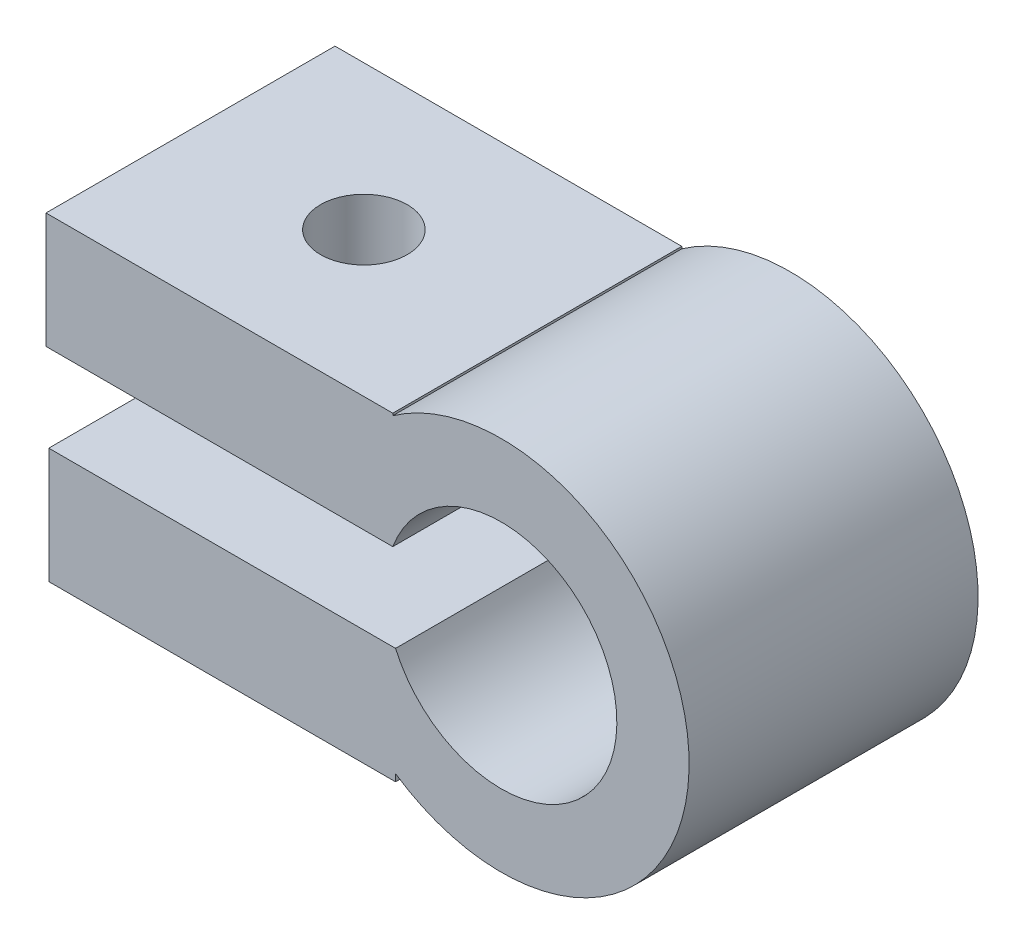
ISO-10303-21;
HEADER;
FILE_DESCRIPTION(('STEP AP214'),'2;1');
FILE_NAME('part.step','',(''),(''),'','','');
FILE_SCHEMA(('AUTOMOTIVE_DESIGN { 1 0 10303 214 1 1 1 1 }'));
ENDSEC;
DATA;
#1=APPLICATION_CONTEXT('core data for automotive mechanical design processes');
#2=APPLICATION_PROTOCOL_DEFINITION('international standard','automotive_design',2000,#1);
#3=PRODUCT_CONTEXT('',#1,'mechanical');
#4=PRODUCT('Part','Part','',(#3));
#5=PRODUCT_RELATED_PRODUCT_CATEGORY('part','',(#4));
#6=PRODUCT_DEFINITION_FORMATION('','',#4);
#7=PRODUCT_DEFINITION_CONTEXT('part definition',#1,'design');
#8=PRODUCT_DEFINITION('design','',#6,#7);
#9=PRODUCT_DEFINITION_SHAPE('','',#8);
#10=(LENGTH_UNIT() NAMED_UNIT(*) SI_UNIT(.MILLI.,.METRE.));
#11=(NAMED_UNIT(*) PLANE_ANGLE_UNIT() SI_UNIT($,.RADIAN.));
#12=(NAMED_UNIT(*) SI_UNIT($,.STERADIAN.) SOLID_ANGLE_UNIT());
#13=UNCERTAINTY_MEASURE_WITH_UNIT(LENGTH_MEASURE(1.E-05),#10,'distance_accuracy_value','');
#14=(GEOMETRIC_REPRESENTATION_CONTEXT(3) GLOBAL_UNCERTAINTY_ASSIGNED_CONTEXT((#13)) GLOBAL_UNIT_ASSIGNED_CONTEXT((#10,
#11,#12)) REPRESENTATION_CONTEXT('',''));
#15=CARTESIAN_POINT('',(0.,0.,0.));
#16=DIRECTION('',(0.,0.,1.));
#17=DIRECTION('',(1.,0.,0.));
#18=AXIS2_PLACEMENT_3D('',#15,#16,#17);
#19=CARTESIAN_POINT('',(-22.0691164066801,-32.0673494114416,5.));
#20=DIRECTION('',(0.,1.,0.));
#21=DIRECTION('',(-1.,0.,0.));
#22=AXIS2_PLACEMENT_3D('',#19,#20,#21);
#23=CYLINDRICAL_SURFACE('',#22,1.5);
#24=CARTESIAN_POINT('',(-22.0691164066801,0.932650588558397,5.));
#25=DIRECTION('',(0.,-1.,0.));
#26=DIRECTION('',(0.,0.,-1.));
#27=AXIS2_PLACEMENT_3D('',#24,#25,#26);
#28=CIRCLE('',#27,1.5);
#29=CARTESIAN_POINT('',(-22.0691164066801,0.932650588558397,3.5));
#30=VERTEX_POINT('',#29);
#31=EDGE_CURVE('E207',#30,#30,#28,.T.);
#32=ORIENTED_EDGE('',*,*,#31,.F.);
#33=EDGE_LOOP('',(#32));
#34=FACE_BOUND('',#33,.T.);
#35=CARTESIAN_POINT('',(-22.0691164066801,-0.0673494114416043,5.));
#36=DIRECTION('',(0.,-1.,0.));
#37=DIRECTION('',(1.,0.,0.));
#38=AXIS2_PLACEMENT_3D('',#35,#36,#37);
#39=CIRCLE('',#38,1.5);
#40=CARTESIAN_POINT('',(-20.5691164066801,-0.0673494114416041,5.));
#41=VERTEX_POINT('',#40);
#42=EDGE_CURVE('E37',#41,#41,#39,.F.);
#43=ORIENTED_EDGE('',*,*,#42,.F.);
#44=EDGE_LOOP('',(#43));
#45=FACE_BOUND('',#44,.T.);
#46=ADVANCED_FACE('F33',(#34,#45),#23,.F.);
#47=CARTESIAN_POINT('',(-12.3154220169601,2.55070325649938,10.));
#48=DIRECTION('',(0.,0.,-1.));
#49=DIRECTION('',(-1.,0.,0.));
#50=AXIS2_PLACEMENT_3D('',#47,#48,#49);
#51=CYLINDRICAL_SURFACE('',#50,6.5);
#52=DIRECTION('',(0.,0.,-1.));
#53=VECTOR('',#52,1.);
#54=CARTESIAN_POINT('',(-15.9735507139539,-2.82220046832493,10.));
#55=LINE('',#54,#53);
#56=CARTESIAN_POINT('',(-15.9735507139539,-2.82220046832493,0.));
#57=VERTEX_POINT('',#56);
#58=CARTESIAN_POINT('',(-15.9735507139539,-2.82220046832493,10.));
#59=VERTEX_POINT('',#58);
#60=EDGE_CURVE('E227',#57,#59,#55,.F.);
#61=ORIENTED_EDGE('',*,*,#60,.F.);
#62=CARTESIAN_POINT('',(-12.3154220169601,2.55070325649938,0.));
#63=DIRECTION('',(0.,0.,1.));
#64=DIRECTION('',(1.,0.,0.));
#65=AXIS2_PLACEMENT_3D('',#62,#63,#64);
#66=CIRCLE('',#65,6.5);
#67=CARTESIAN_POINT('',(-16.0691164066801,7.85728204405969,0.));
#68=VERTEX_POINT('',#67);
#69=EDGE_CURVE('E275',#57,#68,#66,.T.);
#70=ORIENTED_EDGE('',*,*,#69,.T.);
#71=DIRECTION('',(0.,0.,-1.));
#72=VECTOR('',#71,1.);
#73=CARTESIAN_POINT('',(-16.0691164066801,7.85728204405969,10.));
#74=LINE('',#73,#72);
#75=CARTESIAN_POINT('',(-16.0691164066801,7.85728204405969,10.));
#76=VERTEX_POINT('',#75);
#77=EDGE_CURVE('E259',#76,#68,#74,.T.);
#78=ORIENTED_EDGE('',*,*,#77,.F.);
#79=CARTESIAN_POINT('',(-12.3154220169601,2.55070325649938,10.));
#80=DIRECTION('',(0.,0.,1.));
#81=DIRECTION('',(1.,0.,0.));
#82=AXIS2_PLACEMENT_3D('',#79,#80,#81);
#83=CIRCLE('',#82,6.5);
#84=EDGE_CURVE('E278',#59,#76,#83,.T.);
#85=ORIENTED_EDGE('',*,*,#84,.F.);
#86=EDGE_LOOP('',(#61,#70,#78,#85));
#87=FACE_BOUND('',#86,.T.);
#88=ADVANCED_FACE('F35',(#87),#51,.T.);
#89=CARTESIAN_POINT('',(-12.3154220169601,2.55070325649938,10.));
#90=DIRECTION('',(0.,0.,1.));
#91=DIRECTION('',(1.,0.,0.));
#92=AXIS2_PLACEMENT_3D('',#89,#90,#91);
#93=PLANE('',#92);
#94=DIRECTION('',(1.,0.,0.));
#95=VECTOR('',#94,1.);
#96=CARTESIAN_POINT('',(-18.9664230387728,0.932650588558395,10.));
#97=LINE('',#96,#95);
#98=CARTESIAN_POINT('',(-27.9735507139539,0.932650588558394,10.));
#99=VERTEX_POINT('',#98);
#100=CARTESIAN_POINT('',(-15.9735507139539,0.932650588558395,10.));
#101=VERTEX_POINT('',#100);
#102=EDGE_CURVE('E262',#99,#101,#97,.T.);
#103=ORIENTED_EDGE('',*,*,#102,.F.);
#104=DIRECTION('',(0.,-1.,0.));
#105=VECTOR('',#104,1.);
#106=CARTESIAN_POINT('',(-27.9735507139539,0.932650588558394,10.));
#107=LINE('',#106,#105);
#108=CARTESIAN_POINT('',(-27.9735507139539,-3.06734941144161,10.));
#109=VERTEX_POINT('',#108);
#110=EDGE_CURVE('E219',#99,#109,#107,.T.);
#111=ORIENTED_EDGE('',*,*,#110,.T.);
#112=DIRECTION('',(-1.,0.,0.));
#113=VECTOR('',#112,1.);
#114=CARTESIAN_POINT('',(-15.9735507139539,-3.06734941144161,10.));
#115=LINE('',#114,#113);
#116=CARTESIAN_POINT('',(-15.9735507139539,-3.06734941144161,10.));
#117=VERTEX_POINT('',#116);
#118=EDGE_CURVE('E222',#117,#109,#115,.T.);
#119=ORIENTED_EDGE('',*,*,#118,.F.);
#120=DIRECTION('',(0.,-1.,0.));
#121=VECTOR('',#120,1.);
#122=CARTESIAN_POINT('',(-15.9735507139539,0.932650588558395,10.));
#123=LINE('',#122,#121);
#124=EDGE_CURVE('E57',#59,#117,#123,.T.);
#125=ORIENTED_EDGE('',*,*,#124,.F.);
#126=ORIENTED_EDGE('',*,*,#84,.T.);
#127=DIRECTION('',(0.,-1.,0.));
#128=VECTOR('',#127,1.);
#129=CARTESIAN_POINT('',(-16.0691164066801,7.9326505885584,10.));
#130=LINE('',#129,#128);
#131=CARTESIAN_POINT('',(-16.0691164066801,7.9326505885584,10.));
#132=VERTEX_POINT('',#131);
#133=EDGE_CURVE('E239',#132,#76,#130,.T.);
#134=ORIENTED_EDGE('',*,*,#133,.F.);
#135=DIRECTION('',(-1.,0.,0.));
#136=VECTOR('',#135,1.);
#137=CARTESIAN_POINT('',(-16.0691164066801,7.9326505885584,10.));
#138=LINE('',#137,#136);
#139=CARTESIAN_POINT('',(-28.0691164066801,7.93265058855839,10.));
#140=VERTEX_POINT('',#139);
#141=EDGE_CURVE('E248',#132,#140,#138,.T.);
#142=ORIENTED_EDGE('',*,*,#141,.T.);
#143=DIRECTION('',(0.,-1.,0.));
#144=VECTOR('',#143,1.);
#145=CARTESIAN_POINT('',(-28.0691164066801,7.93265058855839,10.));
#146=LINE('',#145,#144);
#147=CARTESIAN_POINT('',(-28.0691164066801,3.93265058855839,10.));
#148=VERTEX_POINT('',#147);
#149=EDGE_CURVE('E234',#140,#148,#146,.T.);
#150=ORIENTED_EDGE('',*,*,#149,.T.);
#151=DIRECTION('',(-1.,0.,0.));
#152=VECTOR('',#151,1.);
#153=CARTESIAN_POINT('',(-18.9664230387728,3.9326505885584,10.));
#154=LINE('',#153,#152);
#155=CARTESIAN_POINT('',(-16.0691164066801,3.9326505885584,10.));
#156=VERTEX_POINT('',#155);
#157=EDGE_CURVE('E264',#156,#148,#154,.T.);
#158=ORIENTED_EDGE('',*,*,#157,.F.);
#159=CARTESIAN_POINT('',(-12.3154220169601,2.55070325649938,10.));
#160=DIRECTION('',(0.,0.,1.));
#161=DIRECTION('',(1.,0.,0.));
#162=AXIS2_PLACEMENT_3D('',#159,#160,#161);
#163=CIRCLE('',#162,4.);
#164=EDGE_CURVE('E272',#101,#156,#163,.T.);
#165=ORIENTED_EDGE('',*,*,#164,.F.);
#166=EDGE_LOOP('',(#103,#111,#119,#125,#126,#134,#142,#150,#158,#165));
#167=FACE_BOUND('',#166,.T.);
#168=ADVANCED_FACE('F297',(#167),#93,.T.);
#169=CARTESIAN_POINT('',(-12.3154220169601,2.55070325649938,0.));
#170=DIRECTION('',(0.,0.,1.));
#171=DIRECTION('',(1.,0.,0.));
#172=AXIS2_PLACEMENT_3D('',#169,#170,#171);
#173=PLANE('',#172);
#174=DIRECTION('',(1.,0.,0.));
#175=VECTOR('',#174,1.);
#176=CARTESIAN_POINT('',(-12.3154220169601,0.932650588558395,0.));
#177=LINE('',#176,#175);
#178=CARTESIAN_POINT('',(-27.9735507139539,0.932650588558394,0.));
#179=VERTEX_POINT('',#178);
#180=CARTESIAN_POINT('',(-15.9735507139539,0.932650588558395,0.));
#181=VERTEX_POINT('',#180);
#182=EDGE_CURVE('E266',#179,#181,#177,.T.);
#183=ORIENTED_EDGE('',*,*,#182,.T.);
#184=CARTESIAN_POINT('',(-12.3154220169601,2.55070325649938,0.));
#185=DIRECTION('',(0.,0.,1.));
#186=DIRECTION('',(1.,0.,0.));
#187=AXIS2_PLACEMENT_3D('',#184,#185,#186);
#188=CIRCLE('',#187,4.);
#189=CARTESIAN_POINT('',(-16.0691164066801,3.9326505885584,0.));
#190=VERTEX_POINT('',#189);
#191=EDGE_CURVE('E271',#181,#190,#188,.T.);
#192=ORIENTED_EDGE('',*,*,#191,.T.);
#193=DIRECTION('',(-1.,0.,0.));
#194=VECTOR('',#193,1.);
#195=CARTESIAN_POINT('',(-12.3154220169601,3.9326505885584,0.));
#196=LINE('',#195,#194);
#197=CARTESIAN_POINT('',(-28.0691164066801,3.93265058855839,0.));
#198=VERTEX_POINT('',#197);
#199=EDGE_CURVE('E269',#190,#198,#196,.T.);
#200=ORIENTED_EDGE('',*,*,#199,.T.);
#201=DIRECTION('',(0.,-1.,0.));
#202=VECTOR('',#201,1.);
#203=CARTESIAN_POINT('',(-28.0691164066801,7.93265058855839,0.));
#204=LINE('',#203,#202);
#205=CARTESIAN_POINT('',(-28.0691164066801,7.93265058855839,0.));
#206=VERTEX_POINT('',#205);
#207=EDGE_CURVE('E235',#206,#198,#204,.T.);
#208=ORIENTED_EDGE('',*,*,#207,.F.);
#209=DIRECTION('',(-1.,0.,0.));
#210=VECTOR('',#209,1.);
#211=CARTESIAN_POINT('',(-16.0691164066801,7.9326505885584,0.));
#212=LINE('',#211,#210);
#213=CARTESIAN_POINT('',(-16.0691164066801,7.9326505885584,0.));
#214=VERTEX_POINT('',#213);
#215=EDGE_CURVE('E238',#214,#206,#212,.T.);
#216=ORIENTED_EDGE('',*,*,#215,.F.);
#217=DIRECTION('',(0.,-1.,0.));
#218=VECTOR('',#217,1.);
#219=CARTESIAN_POINT('',(-16.0691164066801,7.9326505885584,0.));
#220=LINE('',#219,#218);
#221=EDGE_CURVE('E242',#214,#68,#220,.T.);
#222=ORIENTED_EDGE('',*,*,#221,.T.);
#223=ORIENTED_EDGE('',*,*,#69,.F.);
#224=DIRECTION('',(0.,-1.,0.));
#225=VECTOR('',#224,1.);
#226=CARTESIAN_POINT('',(-15.9735507139539,0.932650588558395,0.));
#227=LINE('',#226,#225);
#228=CARTESIAN_POINT('',(-15.9735507139539,-3.06734941144161,0.));
#229=VERTEX_POINT('',#228);
#230=EDGE_CURVE('E223',#57,#229,#227,.T.);
#231=ORIENTED_EDGE('',*,*,#230,.T.);
#232=DIRECTION('',(-1.,0.,0.));
#233=VECTOR('',#232,1.);
#234=CARTESIAN_POINT('',(-15.9735507139539,-3.06734941144161,0.));
#235=LINE('',#234,#233);
#236=CARTESIAN_POINT('',(-27.9735507139539,-3.06734941144161,0.));
#237=VERTEX_POINT('',#236);
#238=EDGE_CURVE('E230',#229,#237,#235,.T.);
#239=ORIENTED_EDGE('',*,*,#238,.T.);
#240=DIRECTION('',(0.,-1.,0.));
#241=VECTOR('',#240,1.);
#242=CARTESIAN_POINT('',(-27.9735507139539,0.932650588558394,0.));
#243=LINE('',#242,#241);
#244=EDGE_CURVE('E218',#179,#237,#243,.T.);
#245=ORIENTED_EDGE('',*,*,#244,.F.);
#246=EDGE_LOOP('',(#183,#192,#200,#208,#216,#222,#223,#231,#239,#245));
#247=FACE_BOUND('',#246,.T.);
#248=ADVANCED_FACE('F290',(#247),#173,.F.);
#249=CARTESIAN_POINT('',(-12.3154220169601,2.55070325649938,10.));
#250=DIRECTION('',(0.,0.,-1.));
#251=DIRECTION('',(-1.,0.,0.));
#252=AXIS2_PLACEMENT_3D('',#249,#250,#251);
#253=CYLINDRICAL_SURFACE('',#252,4.);
#254=DIRECTION('',(0.,0.,-1.));
#255=VECTOR('',#254,1.);
#256=CARTESIAN_POINT('',(-16.0691164066801,3.9326505885584,10.));
#257=LINE('',#256,#255);
#258=EDGE_CURVE('E11',#190,#156,#257,.F.);
#259=ORIENTED_EDGE('',*,*,#258,.F.);
#260=ORIENTED_EDGE('',*,*,#191,.F.);
#261=DIRECTION('',(0.,0.,-1.));
#262=VECTOR('',#261,1.);
#263=CARTESIAN_POINT('',(-15.9735507139539,0.932650588558395,10.));
#264=LINE('',#263,#262);
#265=EDGE_CURVE('E42',#101,#181,#264,.T.);
#266=ORIENTED_EDGE('',*,*,#265,.F.);
#267=ORIENTED_EDGE('',*,*,#164,.T.);
#268=EDGE_LOOP('',(#259,#260,#266,#267));
#269=FACE_BOUND('',#268,.T.);
#270=ADVANCED_FACE('F292',(#269),#253,.F.);
#271=CARTESIAN_POINT('',(-18.9664230387728,0.932650588558395,-23.));
#272=DIRECTION('',(0.,-1.,0.));
#273=DIRECTION('',(0.,0.,-1.));
#274=AXIS2_PLACEMENT_3D('',#271,#272,#273);
#275=PLANE('',#274);
#276=ORIENTED_EDGE('',*,*,#31,.T.);
#277=EDGE_LOOP('',(#276));
#278=FACE_BOUND('',#277,.T.);
#279=ORIENTED_EDGE('',*,*,#102,.T.);
#280=ORIENTED_EDGE('',*,*,#265,.T.);
#281=ORIENTED_EDGE('',*,*,#182,.F.);
#282=DIRECTION('',(0.,0.,1.));
#283=VECTOR('',#282,1.);
#284=CARTESIAN_POINT('',(-27.9735507139539,0.932650588558394,0.));
#285=LINE('',#284,#283);
#286=EDGE_CURVE('E215',#179,#99,#285,.T.);
#287=ORIENTED_EDGE('',*,*,#286,.T.);
#288=EDGE_LOOP('',(#279,#280,#281,#287));
#289=FACE_BOUND('',#288,.T.);
#290=ADVANCED_FACE('F283',(#278,#289),#275,.F.);
#291=CARTESIAN_POINT('',(-18.9664230387728,3.9326505885584,-23.));
#292=DIRECTION('',(0.,1.,0.));
#293=DIRECTION('',(0.,0.,1.));
#294=AXIS2_PLACEMENT_3D('',#291,#292,#293);
#295=PLANE('',#294);
#296=CARTESIAN_POINT('',(-22.0691164066801,3.93265058855839,5.));
#297=DIRECTION('',(0.,1.,0.));
#298=DIRECTION('',(0.,0.,1.));
#299=AXIS2_PLACEMENT_3D('',#296,#297,#298);
#300=CIRCLE('',#299,1.5);
#301=CARTESIAN_POINT('',(-22.0691164066801,3.93265058855839,6.5));
#302=VERTEX_POINT('',#301);
#303=EDGE_CURVE('E204',#302,#302,#300,.T.);
#304=ORIENTED_EDGE('',*,*,#303,.T.);
#305=EDGE_LOOP('',(#304));
#306=FACE_BOUND('',#305,.T.);
#307=ORIENTED_EDGE('',*,*,#199,.F.);
#308=ORIENTED_EDGE('',*,*,#258,.T.);
#309=ORIENTED_EDGE('',*,*,#157,.T.);
#310=DIRECTION('',(0.,0.,1.));
#311=VECTOR('',#310,1.);
#312=CARTESIAN_POINT('',(-28.0691164066801,3.93265058855839,0.));
#313=LINE('',#312,#311);
#314=EDGE_CURVE('E256',#198,#148,#313,.T.);
#315=ORIENTED_EDGE('',*,*,#314,.F.);
#316=EDGE_LOOP('',(#307,#308,#309,#315));
#317=FACE_BOUND('',#316,.T.);
#318=ADVANCED_FACE('F295',(#306,#317),#295,.F.);
#319=CARTESIAN_POINT('',(-16.0691164066801,7.9326505885584,0.));
#320=DIRECTION('',(-1.,0.,0.));
#321=DIRECTION('',(0.,0.,1.));
#322=AXIS2_PLACEMENT_3D('',#319,#320,#321);
#323=PLANE('',#322);
#324=ORIENTED_EDGE('',*,*,#133,.T.);
#325=ORIENTED_EDGE('',*,*,#77,.T.);
#326=ORIENTED_EDGE('',*,*,#221,.F.);
#327=DIRECTION('',(0.,0.,1.));
#328=VECTOR('',#327,1.);
#329=CARTESIAN_POINT('',(-16.0691164066801,7.9326505885584,0.));
#330=LINE('',#329,#328);
#331=EDGE_CURVE('E245',#214,#132,#330,.T.);
#332=ORIENTED_EDGE('',*,*,#331,.T.);
#333=EDGE_LOOP('',(#324,#325,#326,#332));
#334=FACE_BOUND('',#333,.T.);
#335=ADVANCED_FACE('F309',(#334),#323,.F.);
#336=CARTESIAN_POINT('',(-28.0691164066801,7.93265058855839,0.));
#337=DIRECTION('',(-1.,0.,0.));
#338=DIRECTION('',(0.,0.,1.));
#339=AXIS2_PLACEMENT_3D('',#336,#337,#338);
#340=PLANE('',#339);
#341=ORIENTED_EDGE('',*,*,#149,.F.);
#342=DIRECTION('',(0.,0.,1.));
#343=VECTOR('',#342,1.);
#344=CARTESIAN_POINT('',(-28.0691164066801,7.93265058855839,0.));
#345=LINE('',#344,#343);
#346=EDGE_CURVE('E254',#206,#140,#345,.T.);
#347=ORIENTED_EDGE('',*,*,#346,.F.);
#348=ORIENTED_EDGE('',*,*,#207,.T.);
#349=ORIENTED_EDGE('',*,*,#314,.T.);
#350=EDGE_LOOP('',(#341,#347,#348,#349));
#351=FACE_BOUND('',#350,.T.);
#352=ADVANCED_FACE('F302',(#351),#340,.T.);
#353=CARTESIAN_POINT('',(-16.0691164066801,7.9326505885584,0.));
#354=DIRECTION('',(0.,1.,0.));
#355=DIRECTION('',(-1.,0.,0.));
#356=AXIS2_PLACEMENT_3D('',#353,#354,#355);
#357=PLANE('',#356);
#358=CARTESIAN_POINT('',(-22.0691164066801,7.9326505885584,5.));
#359=DIRECTION('',(0.,1.,0.));
#360=DIRECTION('',(-1.,0.,0.));
#361=AXIS2_PLACEMENT_3D('',#358,#359,#360);
#362=CIRCLE('',#361,1.5);
#363=CARTESIAN_POINT('',(-23.5691164066801,7.9326505885584,5.));
#364=VERTEX_POINT('',#363);
#365=EDGE_CURVE('E201',#364,#364,#362,.T.);
#366=ORIENTED_EDGE('',*,*,#365,.F.);
#367=EDGE_LOOP('',(#366));
#368=FACE_BOUND('',#367,.T.);
#369=ORIENTED_EDGE('',*,*,#141,.F.);
#370=ORIENTED_EDGE('',*,*,#331,.F.);
#371=ORIENTED_EDGE('',*,*,#215,.T.);
#372=ORIENTED_EDGE('',*,*,#346,.T.);
#373=EDGE_LOOP('',(#369,#370,#371,#372));
#374=FACE_BOUND('',#373,.T.);
#375=ADVANCED_FACE('F306',(#368,#374),#357,.T.);
#376=CARTESIAN_POINT('',(-15.9735507139539,0.932650588558395,0.));
#377=DIRECTION('',(-1.,0.,0.));
#378=DIRECTION('',(0.,0.,1.));
#379=AXIS2_PLACEMENT_3D('',#376,#377,#378);
#380=PLANE('',#379);
#381=ORIENTED_EDGE('',*,*,#230,.F.);
#382=ORIENTED_EDGE('',*,*,#60,.T.);
#383=ORIENTED_EDGE('',*,*,#124,.T.);
#384=DIRECTION('',(0.,0.,1.));
#385=VECTOR('',#384,1.);
#386=CARTESIAN_POINT('',(-15.9735507139539,-3.06734941144161,0.));
#387=LINE('',#386,#385);
#388=EDGE_CURVE('E210',#229,#117,#387,.T.);
#389=ORIENTED_EDGE('',*,*,#388,.F.);
#390=EDGE_LOOP('',(#381,#382,#383,#389));
#391=FACE_BOUND('',#390,.T.);
#392=ADVANCED_FACE('F317',(#391),#380,.F.);
#393=CARTESIAN_POINT('',(-15.9735507139539,-3.06734941144161,0.));
#394=DIRECTION('',(0.,1.,0.));
#395=DIRECTION('',(-1.,0.,0.));
#396=AXIS2_PLACEMENT_3D('',#393,#394,#395);
#397=PLANE('',#396);
#398=DIRECTION('',(-0.866025403784439,0.,0.499999999999999));
#399=VECTOR('',#398,1.);
#400=CARTESIAN_POINT('',(-19.0511490570329,-3.06734941144161,6.66947418505183));
#401=LINE('',#400,#399);
#402=CARTESIAN_POINT('',(-19.0511490570329,-3.06734941144161,6.66947418505183));
#403=VERTEX_POINT('',#402);
#404=CARTESIAN_POINT('',(-22.0511490570329,-3.06734941144161,8.4015249926207));
#405=VERTEX_POINT('',#404);
#406=EDGE_CURVE('E182',#403,#405,#401,.T.);
#407=ORIENTED_EDGE('',*,*,#406,.F.);
#408=DIRECTION('',(0.,0.,1.));
#409=VECTOR('',#408,1.);
#410=CARTESIAN_POINT('',(-19.0511490570329,-3.06734941144161,3.20537256991408));
#411=LINE('',#410,#409);
#412=CARTESIAN_POINT('',(-19.0511490570329,-3.06734941144161,3.20537256991408));
#413=VERTEX_POINT('',#412);
#414=EDGE_CURVE('E49',#413,#403,#411,.T.);
#415=ORIENTED_EDGE('',*,*,#414,.F.);
#416=DIRECTION('',(0.866025403784438,0.,0.5));
#417=VECTOR('',#416,1.);
#418=CARTESIAN_POINT('',(-22.0511490570329,-3.06734941144161,1.4733217623452));
#419=LINE('',#418,#417);
#420=CARTESIAN_POINT('',(-22.0511490570329,-3.06734941144161,1.4733217623452));
#421=VERTEX_POINT('',#420);
#422=EDGE_CURVE('E168',#421,#413,#419,.T.);
#423=ORIENTED_EDGE('',*,*,#422,.F.);
#424=DIRECTION('',(0.866025403784439,0.,-0.5));
#425=VECTOR('',#424,1.);
#426=CARTESIAN_POINT('',(-25.0511490570329,-3.06734941144161,3.20537256991408));
#427=LINE('',#426,#425);
#428=CARTESIAN_POINT('',(-25.0511490570329,-3.06734941144161,3.20537256991408));
#429=VERTEX_POINT('',#428);
#430=EDGE_CURVE('E171',#429,#421,#427,.T.);
#431=ORIENTED_EDGE('',*,*,#430,.F.);
#432=DIRECTION('',(0.,0.,-1.));
#433=VECTOR('',#432,1.);
#434=CARTESIAN_POINT('',(-25.0511490570329,-3.06734941144161,6.66947418505183));
#435=LINE('',#434,#433);
#436=CARTESIAN_POINT('',(-25.0511490570329,-3.06734941144161,6.66947418505183));
#437=VERTEX_POINT('',#436);
#438=EDGE_CURVE('E187',#437,#429,#435,.T.);
#439=ORIENTED_EDGE('',*,*,#438,.F.);
#440=DIRECTION('',(-0.866025403784438,0.,-0.5));
#441=VECTOR('',#440,1.);
#442=CARTESIAN_POINT('',(-22.0511490570329,-3.06734941144161,8.4015249926207));
#443=LINE('',#442,#441);
#444=EDGE_CURVE('E184',#405,#437,#443,.T.);
#445=ORIENTED_EDGE('',*,*,#444,.F.);
#446=EDGE_LOOP('',(#407,#415,#423,#431,#439,#445));
#447=FACE_BOUND('',#446,.T.);
#448=ORIENTED_EDGE('',*,*,#118,.T.);
#449=DIRECTION('',(0.,0.,1.));
#450=VECTOR('',#449,1.);
#451=CARTESIAN_POINT('',(-27.9735507139539,-3.06734941144161,0.));
#452=LINE('',#451,#450);
#453=EDGE_CURVE('E213',#237,#109,#452,.T.);
#454=ORIENTED_EDGE('',*,*,#453,.F.);
#455=ORIENTED_EDGE('',*,*,#238,.F.);
#456=ORIENTED_EDGE('',*,*,#388,.T.);
#457=EDGE_LOOP('',(#448,#454,#455,#456));
#458=FACE_BOUND('',#457,.T.);
#459=ADVANCED_FACE('F320',(#447,#458),#397,.F.);
#460=CARTESIAN_POINT('',(-27.9735507139539,0.932650588558394,0.));
#461=DIRECTION('',(-1.,0.,0.));
#462=DIRECTION('',(0.,0.,1.));
#463=AXIS2_PLACEMENT_3D('',#460,#461,#462);
#464=PLANE('',#463);
#465=ORIENTED_EDGE('',*,*,#110,.F.);
#466=ORIENTED_EDGE('',*,*,#286,.F.);
#467=ORIENTED_EDGE('',*,*,#244,.T.);
#468=ORIENTED_EDGE('',*,*,#453,.T.);
#469=EDGE_LOOP('',(#465,#466,#467,#468));
#470=FACE_BOUND('',#469,.T.);
#471=ADVANCED_FACE('F324',(#470),#464,.T.);
#472=ORIENTED_EDGE('',*,*,#365,.T.);
#473=EDGE_LOOP('',(#472));
#474=FACE_BOUND('',#473,.T.);
#475=ORIENTED_EDGE('',*,*,#303,.F.);
#476=EDGE_LOOP('',(#475));
#477=FACE_BOUND('',#476,.T.);
#478=ADVANCED_FACE('F326',(#474,#477),#23,.F.);
#479=CARTESIAN_POINT('',(0.,-0.067349411441603,0.));
#480=DIRECTION('',(0.,-1.,0.));
#481=DIRECTION('',(1.,0.,0.));
#482=AXIS2_PLACEMENT_3D('',#479,#480,#481);
#483=PLANE('',#482);
#484=DIRECTION('',(0.,0.,1.));
#485=VECTOR('',#484,1.);
#486=CARTESIAN_POINT('',(-19.0511490570329,-0.0673494114416056,3.20537256991408));
#487=LINE('',#486,#485);
#488=CARTESIAN_POINT('',(-19.0511490570329,-0.0673494114416056,3.20537256991408));
#489=VERTEX_POINT('',#488);
#490=CARTESIAN_POINT('',(-19.0511490570329,-0.0673494114416056,6.66947418505183));
#491=VERTEX_POINT('',#490);
#492=EDGE_CURVE('E148',#489,#491,#487,.T.);
#493=ORIENTED_EDGE('',*,*,#492,.T.);
#494=DIRECTION('',(-0.866025403784439,0.,0.499999999999999));
#495=VECTOR('',#494,1.);
#496=CARTESIAN_POINT('',(-19.0511490570329,-0.0673494114416056,6.66947418505183));
#497=LINE('',#496,#495);
#498=CARTESIAN_POINT('',(-22.0511490570329,-0.067349411441606,8.4015249926207));
#499=VERTEX_POINT('',#498);
#500=EDGE_CURVE('E157',#491,#499,#497,.T.);
#501=ORIENTED_EDGE('',*,*,#500,.T.);
#502=DIRECTION('',(-0.866025403784438,0.,-0.5));
#503=VECTOR('',#502,1.);
#504=CARTESIAN_POINT('',(-22.0511490570329,-0.067349411441606,8.4015249926207));
#505=LINE('',#504,#503);
#506=CARTESIAN_POINT('',(-25.0511490570329,-0.0673494114416064,6.66947418505183));
#507=VERTEX_POINT('',#506);
#508=EDGE_CURVE('E162',#499,#507,#505,.T.);
#509=ORIENTED_EDGE('',*,*,#508,.T.);
#510=DIRECTION('',(0.,0.,-1.));
#511=VECTOR('',#510,1.);
#512=CARTESIAN_POINT('',(-25.0511490570329,-0.0673494114416064,6.66947418505183));
#513=LINE('',#512,#511);
#514=CARTESIAN_POINT('',(-25.0511490570329,-0.0673494114416064,3.20537256991408));
#515=VERTEX_POINT('',#514);
#516=EDGE_CURVE('E175',#507,#515,#513,.T.);
#517=ORIENTED_EDGE('',*,*,#516,.T.);
#518=DIRECTION('',(0.866025403784439,0.,-0.5));
#519=VECTOR('',#518,1.);
#520=CARTESIAN_POINT('',(-25.0511490570329,-0.0673494114416064,3.20537256991408));
#521=LINE('',#520,#519);
#522=CARTESIAN_POINT('',(-22.0511490570329,-0.067349411441606,1.4733217623452));
#523=VERTEX_POINT('',#522);
#524=EDGE_CURVE('E178',#515,#523,#521,.T.);
#525=ORIENTED_EDGE('',*,*,#524,.T.);
#526=DIRECTION('',(0.866025403784438,0.,0.5));
#527=VECTOR('',#526,1.);
#528=CARTESIAN_POINT('',(-22.0511490570329,-0.067349411441606,1.4733217623452));
#529=LINE('',#528,#527);
#530=EDGE_CURVE('E154',#523,#489,#529,.T.);
#531=ORIENTED_EDGE('',*,*,#530,.T.);
#532=EDGE_LOOP('',(#493,#501,#509,#517,#525,#531));
#533=FACE_BOUND('',#532,.T.);
#534=ORIENTED_EDGE('',*,*,#42,.T.);
#535=EDGE_LOOP('',(#534));
#536=FACE_BOUND('',#535,.T.);
#537=ADVANCED_FACE('F164',(#533,#536),#483,.T.);
#538=CARTESIAN_POINT('',(-19.0511490570329,-0.0673494114416056,3.20537256991408));
#539=DIRECTION('',(1.,0.,0.));
#540=DIRECTION('',(0.,0.,-1.));
#541=AXIS2_PLACEMENT_3D('',#538,#539,#540);
#542=PLANE('',#541);
#543=ORIENTED_EDGE('',*,*,#414,.T.);
#544=DIRECTION('',(0.,-1.,0.));
#545=VECTOR('',#544,1.);
#546=CARTESIAN_POINT('',(-19.0511490570329,-0.0673494114416056,6.66947418505183));
#547=LINE('',#546,#545);
#548=EDGE_CURVE('E144',#491,#403,#547,.T.);
#549=ORIENTED_EDGE('',*,*,#548,.F.);
#550=ORIENTED_EDGE('',*,*,#492,.F.);
#551=DIRECTION('',(0.,-1.,0.));
#552=VECTOR('',#551,1.);
#553=CARTESIAN_POINT('',(-19.0511490570329,-0.0673494114416056,3.20537256991408));
#554=LINE('',#553,#552);
#555=EDGE_CURVE('E192',#489,#413,#554,.T.);
#556=ORIENTED_EDGE('',*,*,#555,.T.);
#557=EDGE_LOOP('',(#543,#549,#550,#556));
#558=FACE_BOUND('',#557,.T.);
#559=ADVANCED_FACE('F146',(#558),#542,.F.);
#560=CARTESIAN_POINT('',(-22.0511490570329,-0.067349411441606,1.4733217623452));
#561=DIRECTION('',(0.500000000000001,0.,-0.866025403784438));
#562=DIRECTION('',(-0.866025403784438,0.,-0.500000000000001));
#563=AXIS2_PLACEMENT_3D('',#560,#561,#562);
#564=PLANE('',#563);
#565=ORIENTED_EDGE('',*,*,#422,.T.);
#566=ORIENTED_EDGE('',*,*,#555,.F.);
#567=ORIENTED_EDGE('',*,*,#530,.F.);
#568=DIRECTION('',(0.,-1.,0.));
#569=VECTOR('',#568,1.);
#570=CARTESIAN_POINT('',(-22.0511490570329,-0.067349411441606,1.4733217623452));
#571=LINE('',#570,#569);
#572=EDGE_CURVE('E194',#523,#421,#571,.T.);
#573=ORIENTED_EDGE('',*,*,#572,.T.);
#574=EDGE_LOOP('',(#565,#566,#567,#573));
#575=FACE_BOUND('',#574,.T.);
#576=ADVANCED_FACE('F434',(#575),#564,.F.);
#577=CARTESIAN_POINT('',(-25.0511490570329,-0.0673494114416064,3.20537256991408));
#578=DIRECTION('',(-0.5,0.,-0.866025403784439));
#579=DIRECTION('',(-0.866025403784439,0.,0.5));
#580=AXIS2_PLACEMENT_3D('',#577,#578,#579);
#581=PLANE('',#580);
#582=ORIENTED_EDGE('',*,*,#430,.T.);
#583=ORIENTED_EDGE('',*,*,#572,.F.);
#584=ORIENTED_EDGE('',*,*,#524,.F.);
#585=DIRECTION('',(0.,-1.,0.));
#586=VECTOR('',#585,1.);
#587=CARTESIAN_POINT('',(-25.0511490570329,-0.0673494114416064,3.20537256991408));
#588=LINE('',#587,#586);
#589=EDGE_CURVE('E196',#515,#429,#588,.T.);
#590=ORIENTED_EDGE('',*,*,#589,.T.);
#591=EDGE_LOOP('',(#582,#583,#584,#590));
#592=FACE_BOUND('',#591,.T.);
#593=ADVANCED_FACE('F441',(#592),#581,.F.);
#594=CARTESIAN_POINT('',(-25.0511490570329,-0.0673494114416064,6.66947418505183));
#595=DIRECTION('',(-1.,0.,0.));
#596=DIRECTION('',(0.,-1.,0.));
#597=AXIS2_PLACEMENT_3D('',#594,#595,#596);
#598=PLANE('',#597);
#599=ORIENTED_EDGE('',*,*,#438,.T.);
#600=ORIENTED_EDGE('',*,*,#589,.F.);
#601=ORIENTED_EDGE('',*,*,#516,.F.);
#602=DIRECTION('',(0.,-1.,0.));
#603=VECTOR('',#602,1.);
#604=CARTESIAN_POINT('',(-25.0511490570329,-0.0673494114416064,6.66947418505183));
#605=LINE('',#604,#603);
#606=EDGE_CURVE('E198',#507,#437,#605,.T.);
#607=ORIENTED_EDGE('',*,*,#606,.T.);
#608=EDGE_LOOP('',(#599,#600,#601,#607));
#609=FACE_BOUND('',#608,.T.);
#610=ADVANCED_FACE('F450',(#609),#598,.F.);
#611=CARTESIAN_POINT('',(-22.0511490570329,-0.067349411441606,8.4015249926207));
#612=DIRECTION('',(-0.5,0.,0.866025403784438));
#613=DIRECTION('',(0.866025403784438,0.,0.5));
#614=AXIS2_PLACEMENT_3D('',#611,#612,#613);
#615=PLANE('',#614);
#616=ORIENTED_EDGE('',*,*,#444,.T.);
#617=ORIENTED_EDGE('',*,*,#606,.F.);
#618=ORIENTED_EDGE('',*,*,#508,.F.);
#619=DIRECTION('',(0.,-1.,0.));
#620=VECTOR('',#619,1.);
#621=CARTESIAN_POINT('',(-22.0511490570329,-0.067349411441606,8.4015249926207));
#622=LINE('',#621,#620);
#623=EDGE_CURVE('E153',#499,#405,#622,.T.);
#624=ORIENTED_EDGE('',*,*,#623,.T.);
#625=EDGE_LOOP('',(#616,#617,#618,#624));
#626=FACE_BOUND('',#625,.T.);
#627=ADVANCED_FACE('F459',(#626),#615,.F.);
#628=CARTESIAN_POINT('',(-19.0511490570329,-0.0673494114416056,6.66947418505183));
#629=DIRECTION('',(0.499999999999999,0.,0.866025403784439));
#630=DIRECTION('',(0.866025403784439,0.,-0.499999999999999));
#631=AXIS2_PLACEMENT_3D('',#628,#629,#630);
#632=PLANE('',#631);
#633=ORIENTED_EDGE('',*,*,#406,.T.);
#634=ORIENTED_EDGE('',*,*,#623,.F.);
#635=ORIENTED_EDGE('',*,*,#500,.F.);
#636=ORIENTED_EDGE('',*,*,#548,.T.);
#637=EDGE_LOOP('',(#633,#634,#635,#636));
#638=FACE_BOUND('',#637,.T.);
#639=ADVANCED_FACE('F158',(#638),#632,.F.);
#640=CLOSED_SHELL('',(#46,#88,#168,#248,#270,#290,#318,#335,#352,#375,#392,#459,#471,#478,#537,
#559,#576,#593,#610,#627,#639));
#641=MANIFOLD_SOLID_BREP('B2',#640);
#642=ADVANCED_BREP_SHAPE_REPRESENTATION('',(#18,#641),#14);
#643=SHAPE_DEFINITION_REPRESENTATION(#9,#642);
ENDSEC;
END-ISO-10303-21;
